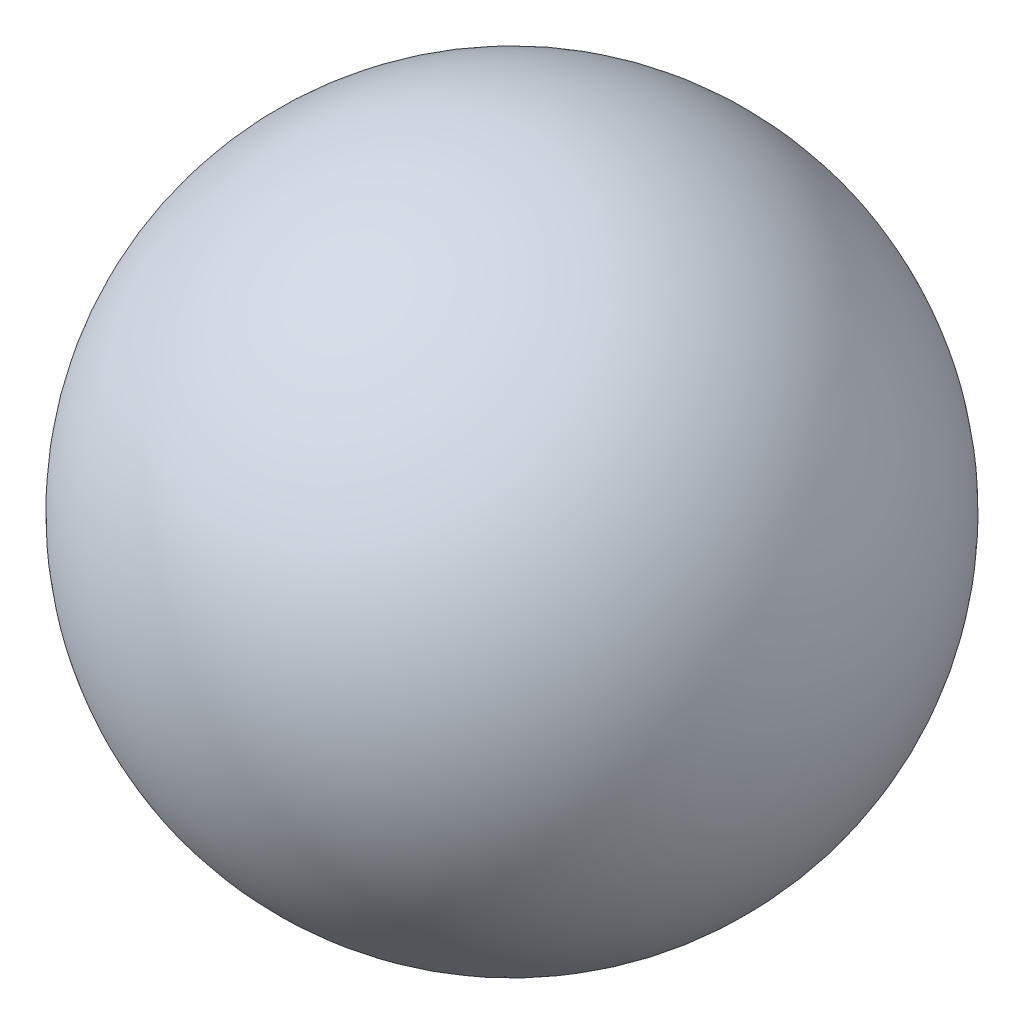
ISO-10303-21;
HEADER;
FILE_DESCRIPTION(('STEP AP214'),'2;1');
FILE_NAME('part.step','',(''),(''),'','','');
FILE_SCHEMA(('AUTOMOTIVE_DESIGN { 1 0 10303 214 1 1 1 1 }'));
ENDSEC;
DATA;
#1=APPLICATION_CONTEXT('core data for automotive mechanical design processes');
#2=APPLICATION_PROTOCOL_DEFINITION('international standard','automotive_design',2000,#1);
#3=PRODUCT_CONTEXT('',#1,'mechanical');
#4=PRODUCT('Part','Part','',(#3));
#5=PRODUCT_RELATED_PRODUCT_CATEGORY('part','',(#4));
#6=PRODUCT_DEFINITION_FORMATION('','',#4);
#7=PRODUCT_DEFINITION_CONTEXT('part definition',#1,'design');
#8=PRODUCT_DEFINITION('design','',#6,#7);
#9=PRODUCT_DEFINITION_SHAPE('','',#8);
#10=(LENGTH_UNIT() NAMED_UNIT(*) SI_UNIT(.MILLI.,.METRE.));
#11=(NAMED_UNIT(*) PLANE_ANGLE_UNIT() SI_UNIT($,.RADIAN.));
#12=(NAMED_UNIT(*) SI_UNIT($,.STERADIAN.) SOLID_ANGLE_UNIT());
#13=UNCERTAINTY_MEASURE_WITH_UNIT(LENGTH_MEASURE(1.E-05),#10,'distance_accuracy_value','');
#14=(GEOMETRIC_REPRESENTATION_CONTEXT(3) GLOBAL_UNCERTAINTY_ASSIGNED_CONTEXT((#13)) GLOBAL_UNIT_ASSIGNED_CONTEXT((#10,
#11,#12)) REPRESENTATION_CONTEXT('',''));
#15=CARTESIAN_POINT('',(0.,0.,0.));
#16=DIRECTION('',(0.,0.,1.));
#17=DIRECTION('',(1.,0.,0.));
#18=AXIS2_PLACEMENT_3D('',#15,#16,#17);
#19=CARTESIAN_POINT('',(0.,0.,0.));
#20=DIRECTION('',(0.,0.,-1.));
#21=DIRECTION('',(1.,0.,0.));
#22=AXIS2_PLACEMENT_3D('',#19,#20,#21);
#23=SPHERICAL_SURFACE('',#22,88.9);
#24=CARTESIAN_POINT('',(0.,0.,-88.9));
#25=VERTEX_POINT('',#24);
#26=VERTEX_LOOP('',#25);
#27=FACE_BOUND('',#26,.T.);
#28=ADVANCED_FACE('F42',(#27),#23,.T.);
#29=CLOSED_SHELL('',(#28));
#30=MANIFOLD_SOLID_BREP('B2',#29);
#31=ADVANCED_BREP_SHAPE_REPRESENTATION('',(#18,#30),#14);
#32=SHAPE_DEFINITION_REPRESENTATION(#9,#31);
ENDSEC;
END-ISO-10303-21;
